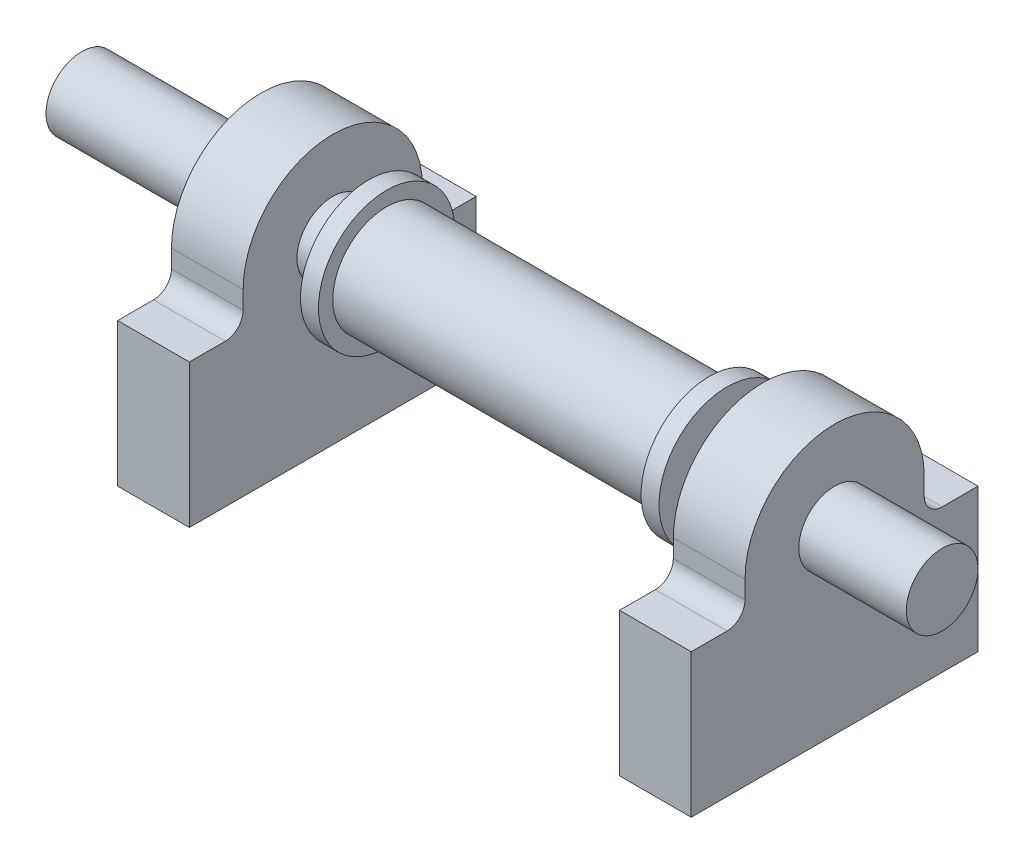
ISO-10303-21;
HEADER;
FILE_DESCRIPTION(('STEP AP214'),'2;1');
FILE_NAME('part.step','',(''),(''),'','','');
FILE_SCHEMA(('AUTOMOTIVE_DESIGN { 1 0 10303 214 1 1 1 1 }'));
ENDSEC;
DATA;
#1=APPLICATION_CONTEXT('core data for automotive mechanical design processes');
#2=APPLICATION_PROTOCOL_DEFINITION('international standard','automotive_design',2000,#1);
#3=PRODUCT_CONTEXT('',#1,'mechanical');
#4=PRODUCT('Part','Part','',(#3));
#5=PRODUCT_RELATED_PRODUCT_CATEGORY('part','',(#4));
#6=PRODUCT_DEFINITION_FORMATION('','',#4);
#7=PRODUCT_DEFINITION_CONTEXT('part definition',#1,'design');
#8=PRODUCT_DEFINITION('design','',#6,#7);
#9=PRODUCT_DEFINITION_SHAPE('','',#8);
#10=(LENGTH_UNIT() NAMED_UNIT(*) SI_UNIT(.MILLI.,.METRE.));
#11=(NAMED_UNIT(*) PLANE_ANGLE_UNIT() SI_UNIT($,.RADIAN.));
#12=(NAMED_UNIT(*) SI_UNIT($,.STERADIAN.) SOLID_ANGLE_UNIT());
#13=UNCERTAINTY_MEASURE_WITH_UNIT(LENGTH_MEASURE(1.E-05),#10,'distance_accuracy_value','');
#14=(GEOMETRIC_REPRESENTATION_CONTEXT(3) GLOBAL_UNCERTAINTY_ASSIGNED_CONTEXT((#13)) GLOBAL_UNIT_ASSIGNED_CONTEXT((#10,
#11,#12)) REPRESENTATION_CONTEXT('',''));
#15=CARTESIAN_POINT('',(0.,0.,0.));
#16=DIRECTION('',(0.,0.,1.));
#17=DIRECTION('',(1.,0.,0.));
#18=AXIS2_PLACEMENT_3D('',#15,#16,#17);
#19=CARTESIAN_POINT('',(-45.,50.,0.));
#20=DIRECTION('',(-1.,0.,0.));
#21=DIRECTION('',(0.,0.,1.));
#22=AXIS2_PLACEMENT_3D('',#19,#20,#21);
#23=CYLINDRICAL_SURFACE('',#22,19.);
#24=CARTESIAN_POINT('',(-45.,50.,0.));
#25=DIRECTION('',(1.,0.,0.));
#26=DIRECTION('',(0.,0.,-1.));
#27=AXIS2_PLACEMENT_3D('',#24,#25,#26);
#28=CIRCLE('',#27,19.);
#29=CARTESIAN_POINT('',(-45.,50.,-19.));
#30=VERTEX_POINT('',#29);
#31=EDGE_CURVE('E344',#30,#30,#28,.T.);
#32=ORIENTED_EDGE('',*,*,#31,.F.);
#33=EDGE_LOOP('',(#32));
#34=FACE_BOUND('',#33,.T.);
#35=CARTESIAN_POINT('',(-50.,50.,0.));
#36=DIRECTION('',(1.,0.,0.));
#37=DIRECTION('',(0.,0.,-1.));
#38=AXIS2_PLACEMENT_3D('',#35,#36,#37);
#39=CIRCLE('',#38,19.);
#40=CARTESIAN_POINT('',(-50.,50.,-19.));
#41=VERTEX_POINT('',#40);
#42=EDGE_CURVE('E348',#41,#41,#39,.T.);
#43=ORIENTED_EDGE('',*,*,#42,.T.);
#44=EDGE_LOOP('',(#43));
#45=FACE_BOUND('',#44,.T.);
#46=ADVANCED_FACE('F35',(#34,#45),#23,.T.);
#47=CARTESIAN_POINT('',(-45.,50.,0.));
#48=DIRECTION('',(1.,0.,0.));
#49=DIRECTION('',(0.,0.,-1.));
#50=AXIS2_PLACEMENT_3D('',#47,#48,#49);
#51=PLANE('',#50);
#52=CARTESIAN_POINT('',(-45.,50.,0.));
#53=DIRECTION('',(1.,0.,0.));
#54=DIRECTION('',(0.,0.,-1.));
#55=AXIS2_PLACEMENT_3D('',#52,#53,#54);
#56=CIRCLE('',#55,15.);
#57=CARTESIAN_POINT('',(-45.,50.,-15.));
#58=VERTEX_POINT('',#57);
#59=EDGE_CURVE('E358',#58,#58,#56,.F.);
#60=ORIENTED_EDGE('',*,*,#59,.T.);
#61=EDGE_LOOP('',(#60));
#62=FACE_BOUND('',#61,.T.);
#63=ORIENTED_EDGE('',*,*,#31,.T.);
#64=EDGE_LOOP('',(#63));
#65=FACE_BOUND('',#64,.T.);
#66=ADVANCED_FACE('F391',(#62,#65),#51,.T.);
#67=CARTESIAN_POINT('',(-50.,50.,0.));
#68=DIRECTION('',(1.,0.,0.));
#69=DIRECTION('',(0.,0.,-1.));
#70=AXIS2_PLACEMENT_3D('',#67,#68,#69);
#71=PLANE('',#70);
#72=ORIENTED_EDGE('',*,*,#42,.F.);
#73=EDGE_LOOP('',(#72));
#74=FACE_BOUND('',#73,.T.);
#75=CARTESIAN_POINT('',(-50.,50.,0.));
#76=DIRECTION('',(1.,0.,0.));
#77=DIRECTION('',(0.,0.,-1.));
#78=AXIS2_PLACEMENT_3D('',#75,#76,#77);
#79=CIRCLE('',#78,10.);
#80=CARTESIAN_POINT('',(-50.,50.,-10.));
#81=VERTEX_POINT('',#80);
#82=EDGE_CURVE('E248',#81,#81,#79,.F.);
#83=ORIENTED_EDGE('',*,*,#82,.F.);
#84=EDGE_LOOP('',(#83));
#85=FACE_BOUND('',#84,.T.);
#86=ADVANCED_FACE('F397',(#74,#85),#71,.F.);
#87=CARTESIAN_POINT('',(-130.,50.,0.));
#88=DIRECTION('',(-1.,0.,0.));
#89=DIRECTION('',(0.,0.,1.));
#90=AXIS2_PLACEMENT_3D('',#87,#88,#89);
#91=PLANE('',#90);
#92=CARTESIAN_POINT('',(-130.,50.,0.));
#93=DIRECTION('',(-1.,0.,0.));
#94=DIRECTION('',(0.,0.,1.));
#95=AXIS2_PLACEMENT_3D('',#92,#93,#94);
#96=CIRCLE('',#95,10.);
#97=CARTESIAN_POINT('',(-130.,50.,10.));
#98=VERTEX_POINT('',#97);
#99=EDGE_CURVE('E264',#98,#98,#96,.T.);
#100=ORIENTED_EDGE('',*,*,#99,.T.);
#101=EDGE_LOOP('',(#100));
#102=FACE_BOUND('',#101,.T.);
#103=ADVANCED_FACE('F443',(#102),#91,.T.);
#104=CARTESIAN_POINT('',(110.,50.,0.));
#105=DIRECTION('',(-1.,0.,0.));
#106=DIRECTION('',(0.,0.,1.));
#107=AXIS2_PLACEMENT_3D('',#104,#105,#106);
#108=CYLINDRICAL_SURFACE('',#107,10.);
#109=ORIENTED_EDGE('',*,*,#99,.F.);
#110=EDGE_LOOP('',(#109));
#111=FACE_BOUND('',#110,.T.);
#112=CARTESIAN_POINT('',(-80.,50.,0.));
#113=DIRECTION('',(-1.,0.,0.));
#114=DIRECTION('',(0.,0.,1.));
#115=AXIS2_PLACEMENT_3D('',#112,#113,#114);
#116=CIRCLE('',#115,10.);
#117=CARTESIAN_POINT('',(-80.,50.,10.));
#118=VERTEX_POINT('',#117);
#119=EDGE_CURVE('E273',#118,#118,#116,.T.);
#120=ORIENTED_EDGE('',*,*,#119,.T.);
#121=EDGE_LOOP('',(#120));
#122=FACE_BOUND('',#121,.T.);
#123=ADVANCED_FACE('F386',(#111,#122),#108,.T.);
#124=CARTESIAN_POINT('',(-80.,40.,-40.));
#125=DIRECTION('',(1.,0.,0.));
#126=DIRECTION('',(0.,0.,-1.));
#127=AXIS2_PLACEMENT_3D('',#124,#125,#126);
#128=PLANE('',#127);
#129=ORIENTED_EDGE('',*,*,#119,.F.);
#130=EDGE_LOOP('',(#129));
#131=FACE_BOUND('',#130,.T.);
#132=DIRECTION('',(0.,0.,1.));
#133=VECTOR('',#132,1.);
#134=CARTESIAN_POINT('',(-80.,0.,-40.));
#135=LINE('',#134,#133);
#136=CARTESIAN_POINT('',(-80.,0.,-40.));
#137=VERTEX_POINT('',#136);
#138=CARTESIAN_POINT('',(-80.,0.,40.));
#139=VERTEX_POINT('',#138);
#140=EDGE_CURVE('E315',#137,#139,#135,.T.);
#141=ORIENTED_EDGE('',*,*,#140,.T.);
#142=DIRECTION('',(0.,-1.,0.));
#143=VECTOR('',#142,1.);
#144=CARTESIAN_POINT('',(-80.,40.,40.));
#145=LINE('',#144,#143);
#146=CARTESIAN_POINT('',(-80.,40.,40.));
#147=VERTEX_POINT('',#146);
#148=EDGE_CURVE('E321',#147,#139,#145,.T.);
#149=ORIENTED_EDGE('',*,*,#148,.F.);
#150=DIRECTION('',(0.,0.,1.));
#151=VECTOR('',#150,1.);
#152=CARTESIAN_POINT('',(-80.,40.,-40.));
#153=LINE('',#152,#151);
#154=CARTESIAN_POINT('',(-80.,40.,30.));
#155=VERTEX_POINT('',#154);
#156=EDGE_CURVE('E304',#155,#147,#153,.T.);
#157=ORIENTED_EDGE('',*,*,#156,.F.);
#158=CARTESIAN_POINT('',(-80.,45.,30.));
#159=DIRECTION('',(1.,0.,0.));
#160=DIRECTION('',(0.,0.,-1.));
#161=AXIS2_PLACEMENT_3D('',#158,#159,#160);
#162=CIRCLE('',#161,5.);
#163=CARTESIAN_POINT('',(-80.,45.,25.));
#164=VERTEX_POINT('',#163);
#165=EDGE_CURVE('E44',#155,#164,#162,.T.);
#166=ORIENTED_EDGE('',*,*,#165,.T.);
#167=DIRECTION('',(0.,1.,0.));
#168=VECTOR('',#167,1.);
#169=CARTESIAN_POINT('',(-80.,40.,25.));
#170=LINE('',#169,#168);
#171=CARTESIAN_POINT('',(-80.,50.,25.));
#172=VERTEX_POINT('',#171);
#173=EDGE_CURVE('E281',#164,#172,#170,.T.);
#174=ORIENTED_EDGE('',*,*,#173,.T.);
#175=CARTESIAN_POINT('',(-80.,50.,0.));
#176=DIRECTION('',(-1.,0.,0.));
#177=DIRECTION('',(0.,0.,1.));
#178=AXIS2_PLACEMENT_3D('',#175,#176,#177);
#179=CIRCLE('',#178,25.);
#180=CARTESIAN_POINT('',(-80.,50.,-25.));
#181=VERTEX_POINT('',#180);
#182=EDGE_CURVE('E276',#172,#181,#179,.T.);
#183=ORIENTED_EDGE('',*,*,#182,.T.);
#184=DIRECTION('',(0.,-1.,0.));
#185=VECTOR('',#184,1.);
#186=CARTESIAN_POINT('',(-80.,50.,-25.));
#187=LINE('',#186,#185);
#188=CARTESIAN_POINT('',(-80.,45.,-25.));
#189=VERTEX_POINT('',#188);
#190=EDGE_CURVE('E289',#181,#189,#187,.T.);
#191=ORIENTED_EDGE('',*,*,#190,.T.);
#192=CARTESIAN_POINT('',(-80.,45.,-30.));
#193=DIRECTION('',(1.,0.,0.));
#194=DIRECTION('',(0.,0.,-1.));
#195=AXIS2_PLACEMENT_3D('',#192,#193,#194);
#196=CIRCLE('',#195,5.);
#197=CARTESIAN_POINT('',(-80.,40.,-30.));
#198=VERTEX_POINT('',#197);
#199=EDGE_CURVE('E339',#189,#198,#196,.T.);
#200=ORIENTED_EDGE('',*,*,#199,.T.);
#201=CARTESIAN_POINT('',(-80.,40.,-40.));
#202=VERTEX_POINT('',#201);
#203=EDGE_CURVE('E305',#202,#198,#153,.T.);
#204=ORIENTED_EDGE('',*,*,#203,.F.);
#205=DIRECTION('',(0.,-1.,0.));
#206=VECTOR('',#205,1.);
#207=CARTESIAN_POINT('',(-80.,40.,-40.));
#208=LINE('',#207,#206);
#209=EDGE_CURVE('E324',#202,#137,#208,.T.);
#210=ORIENTED_EDGE('',*,*,#209,.T.);
#211=EDGE_LOOP('',(#141,#149,#157,#166,#174,#183,#191,#200,#204,#210));
#212=FACE_BOUND('',#211,.T.);
#213=ADVANCED_FACE('F474',(#131,#212),#128,.F.);
#214=CARTESIAN_POINT('',(-80.,40.,40.));
#215=DIRECTION('',(0.,0.,-1.));
#216=DIRECTION('',(-1.,0.,0.));
#217=AXIS2_PLACEMENT_3D('',#214,#215,#216);
#218=PLANE('',#217);
#219=DIRECTION('',(1.,0.,0.));
#220=VECTOR('',#219,1.);
#221=CARTESIAN_POINT('',(-80.,0.,40.));
#222=LINE('',#221,#220);
#223=CARTESIAN_POINT('',(-60.,0.,40.));
#224=VERTEX_POINT('',#223);
#225=EDGE_CURVE('E317',#139,#224,#222,.T.);
#226=ORIENTED_EDGE('',*,*,#225,.T.);
#227=DIRECTION('',(0.,-1.,0.));
#228=VECTOR('',#227,1.);
#229=CARTESIAN_POINT('',(-60.,40.,40.));
#230=LINE('',#229,#228);
#231=CARTESIAN_POINT('',(-60.,40.,40.));
#232=VERTEX_POINT('',#231);
#233=EDGE_CURVE('E310',#232,#224,#230,.T.);
#234=ORIENTED_EDGE('',*,*,#233,.F.);
#235=DIRECTION('',(1.,0.,0.));
#236=VECTOR('',#235,1.);
#237=CARTESIAN_POINT('',(-80.,40.,40.));
#238=LINE('',#237,#236);
#239=EDGE_CURVE('E308',#147,#232,#238,.T.);
#240=ORIENTED_EDGE('',*,*,#239,.F.);
#241=ORIENTED_EDGE('',*,*,#148,.T.);
#242=EDGE_LOOP('',(#226,#234,#240,#241));
#243=FACE_BOUND('',#242,.T.);
#244=ADVANCED_FACE('F471',(#243),#218,.F.);
#245=CARTESIAN_POINT('',(0.,40.,0.));
#246=DIRECTION('',(0.,1.,0.));
#247=DIRECTION('',(0.,0.,1.));
#248=AXIS2_PLACEMENT_3D('',#245,#246,#247);
#249=PLANE('',#248);
#250=DIRECTION('',(0.,0.,-1.));
#251=VECTOR('',#250,1.);
#252=CARTESIAN_POINT('',(-60.,40.,-40.));
#253=LINE('',#252,#251);
#254=CARTESIAN_POINT('',(-60.,40.,30.));
#255=VERTEX_POINT('',#254);
#256=EDGE_CURVE('E298',#232,#255,#253,.T.);
#257=ORIENTED_EDGE('',*,*,#256,.T.);
#258=DIRECTION('',(-1.,0.,0.));
#259=VECTOR('',#258,1.);
#260=CARTESIAN_POINT('',(-80.,40.,30.));
#261=LINE('',#260,#259);
#262=EDGE_CURVE('E335',#255,#155,#261,.T.);
#263=ORIENTED_EDGE('',*,*,#262,.T.);
#264=ORIENTED_EDGE('',*,*,#156,.T.);
#265=ORIENTED_EDGE('',*,*,#239,.T.);
#266=EDGE_LOOP('',(#257,#263,#264,#265));
#267=FACE_BOUND('',#266,.T.);
#268=ADVANCED_FACE('F466',(#267),#249,.T.);
#269=CARTESIAN_POINT('',(0.,45.,30.));
#270=DIRECTION('',(1.,0.,0.));
#271=DIRECTION('',(0.,0.,-1.));
#272=AXIS2_PLACEMENT_3D('',#269,#270,#271);
#273=CYLINDRICAL_SURFACE('',#272,5.);
#274=CARTESIAN_POINT('',(-60.,45.,30.));
#275=DIRECTION('',(-1.,0.,0.));
#276=DIRECTION('',(0.,0.,1.));
#277=AXIS2_PLACEMENT_3D('',#274,#275,#276);
#278=CIRCLE('',#277,5.);
#279=CARTESIAN_POINT('',(-60.,45.,25.));
#280=VERTEX_POINT('',#279);
#281=EDGE_CURVE('E11',#280,#255,#278,.T.);
#282=ORIENTED_EDGE('',*,*,#281,.F.);
#283=DIRECTION('',(-1.,0.,0.));
#284=VECTOR('',#283,1.);
#285=CARTESIAN_POINT('',(-60.,45.,25.));
#286=LINE('',#285,#284);
#287=EDGE_CURVE('E52',#164,#280,#286,.F.);
#288=ORIENTED_EDGE('',*,*,#287,.F.);
#289=ORIENTED_EDGE('',*,*,#165,.F.);
#290=ORIENTED_EDGE('',*,*,#262,.F.);
#291=EDGE_LOOP('',(#282,#288,#289,#290));
#292=FACE_BOUND('',#291,.T.);
#293=ADVANCED_FACE('F37',(#292),#273,.F.);
#294=CARTESIAN_POINT('',(-60.,40.,25.));
#295=DIRECTION('',(0.,0.,1.));
#296=DIRECTION('',(1.,0.,0.));
#297=AXIS2_PLACEMENT_3D('',#294,#295,#296);
#298=PLANE('',#297);
#299=ORIENTED_EDGE('',*,*,#173,.F.);
#300=ORIENTED_EDGE('',*,*,#287,.T.);
#301=DIRECTION('',(0.,1.,0.));
#302=VECTOR('',#301,1.);
#303=CARTESIAN_POINT('',(-60.,40.,25.));
#304=LINE('',#303,#302);
#305=CARTESIAN_POINT('',(-60.,50.,25.));
#306=VERTEX_POINT('',#305);
#307=EDGE_CURVE('E284',#280,#306,#304,.T.);
#308=ORIENTED_EDGE('',*,*,#307,.T.);
#309=DIRECTION('',(-1.,0.,0.));
#310=VECTOR('',#309,1.);
#311=CARTESIAN_POINT('',(-60.,50.,25.));
#312=LINE('',#311,#310);
#313=EDGE_CURVE('E293',#306,#172,#312,.T.);
#314=ORIENTED_EDGE('',*,*,#313,.T.);
#315=EDGE_LOOP('',(#299,#300,#308,#314));
#316=FACE_BOUND('',#315,.T.);
#317=ADVANCED_FACE('F449',(#316),#298,.T.);
#318=CARTESIAN_POINT('',(-60.,50.,0.));
#319=DIRECTION('',(-1.,0.,0.));
#320=DIRECTION('',(0.,0.,1.));
#321=AXIS2_PLACEMENT_3D('',#318,#319,#320);
#322=CYLINDRICAL_SURFACE('',#321,25.);
#323=ORIENTED_EDGE('',*,*,#182,.F.);
#324=ORIENTED_EDGE('',*,*,#313,.F.);
#325=CARTESIAN_POINT('',(-60.,50.,0.));
#326=DIRECTION('',(-1.,0.,0.));
#327=DIRECTION('',(0.,0.,1.));
#328=AXIS2_PLACEMENT_3D('',#325,#326,#327);
#329=CIRCLE('',#328,25.);
#330=CARTESIAN_POINT('',(-60.,50.,-25.));
#331=VERTEX_POINT('',#330);
#332=EDGE_CURVE('E277',#306,#331,#329,.T.);
#333=ORIENTED_EDGE('',*,*,#332,.T.);
#334=DIRECTION('',(-1.,0.,0.));
#335=VECTOR('',#334,1.);
#336=CARTESIAN_POINT('',(-60.,50.,-25.));
#337=LINE('',#336,#335);
#338=EDGE_CURVE('E286',#331,#181,#337,.T.);
#339=ORIENTED_EDGE('',*,*,#338,.T.);
#340=EDGE_LOOP('',(#323,#324,#333,#339));
#341=FACE_BOUND('',#340,.T.);
#342=ADVANCED_FACE('F452',(#341),#322,.T.);
#343=CARTESIAN_POINT('',(-60.,50.,-25.));
#344=DIRECTION('',(0.,0.,-1.));
#345=DIRECTION('',(-1.,0.,0.));
#346=AXIS2_PLACEMENT_3D('',#343,#344,#345);
#347=PLANE('',#346);
#348=DIRECTION('',(0.,-1.,0.));
#349=VECTOR('',#348,1.);
#350=CARTESIAN_POINT('',(-60.,50.,-25.));
#351=LINE('',#350,#349);
#352=CARTESIAN_POINT('',(-60.,45.,-25.));
#353=VERTEX_POINT('',#352);
#354=EDGE_CURVE('E280',#331,#353,#351,.T.);
#355=ORIENTED_EDGE('',*,*,#354,.T.);
#356=DIRECTION('',(-1.,0.,0.));
#357=VECTOR('',#356,1.);
#358=CARTESIAN_POINT('',(-80.,45.,-25.));
#359=LINE('',#358,#357);
#360=EDGE_CURVE('E330',#353,#189,#359,.T.);
#361=ORIENTED_EDGE('',*,*,#360,.T.);
#362=ORIENTED_EDGE('',*,*,#190,.F.);
#363=ORIENTED_EDGE('',*,*,#338,.F.);
#364=EDGE_LOOP('',(#355,#361,#362,#363));
#365=FACE_BOUND('',#364,.T.);
#366=ADVANCED_FACE('F453',(#365),#347,.T.);
#367=CARTESIAN_POINT('',(-60.,45.,-30.));
#368=DIRECTION('',(1.,0.,0.));
#369=DIRECTION('',(0.,0.,-1.));
#370=AXIS2_PLACEMENT_3D('',#367,#368,#369);
#371=CYLINDRICAL_SURFACE('',#370,5.);
#372=CARTESIAN_POINT('',(-60.,45.,-30.));
#373=DIRECTION('',(-1.,0.,0.));
#374=DIRECTION('',(0.,0.,1.));
#375=AXIS2_PLACEMENT_3D('',#372,#373,#374);
#376=CIRCLE('',#375,5.);
#377=CARTESIAN_POINT('',(-60.,40.,-30.));
#378=VERTEX_POINT('',#377);
#379=EDGE_CURVE('E341',#378,#353,#376,.T.);
#380=ORIENTED_EDGE('',*,*,#379,.F.);
#381=DIRECTION('',(-1.,0.,0.));
#382=VECTOR('',#381,1.);
#383=CARTESIAN_POINT('',(-60.,40.,-30.));
#384=LINE('',#383,#382);
#385=EDGE_CURVE('E333',#198,#378,#384,.F.);
#386=ORIENTED_EDGE('',*,*,#385,.F.);
#387=ORIENTED_EDGE('',*,*,#199,.F.);
#388=ORIENTED_EDGE('',*,*,#360,.F.);
#389=EDGE_LOOP('',(#380,#386,#387,#388));
#390=FACE_BOUND('',#389,.T.);
#391=ADVANCED_FACE('F456',(#390),#371,.F.);
#392=ORIENTED_EDGE('',*,*,#203,.T.);
#393=ORIENTED_EDGE('',*,*,#385,.T.);
#394=CARTESIAN_POINT('',(-60.,40.,-40.));
#395=VERTEX_POINT('',#394);
#396=EDGE_CURVE('E302',#378,#395,#253,.T.);
#397=ORIENTED_EDGE('',*,*,#396,.T.);
#398=DIRECTION('',(-1.,0.,0.));
#399=VECTOR('',#398,1.);
#400=CARTESIAN_POINT('',(-80.,40.,-40.));
#401=LINE('',#400,#399);
#402=EDGE_CURVE('E301',#395,#202,#401,.T.);
#403=ORIENTED_EDGE('',*,*,#402,.T.);
#404=EDGE_LOOP('',(#392,#393,#397,#403));
#405=FACE_BOUND('',#404,.T.);
#406=ADVANCED_FACE('F461',(#405),#249,.T.);
#407=CARTESIAN_POINT('',(-80.,40.,-40.));
#408=DIRECTION('',(0.,0.,1.));
#409=DIRECTION('',(1.,0.,0.));
#410=AXIS2_PLACEMENT_3D('',#407,#408,#409);
#411=PLANE('',#410);
#412=DIRECTION('',(-1.,0.,0.));
#413=VECTOR('',#412,1.);
#414=CARTESIAN_POINT('',(-80.,0.,-40.));
#415=LINE('',#414,#413);
#416=CARTESIAN_POINT('',(-60.,0.,-40.));
#417=VERTEX_POINT('',#416);
#418=EDGE_CURVE('E313',#417,#137,#415,.T.);
#419=ORIENTED_EDGE('',*,*,#418,.T.);
#420=ORIENTED_EDGE('',*,*,#209,.F.);
#421=ORIENTED_EDGE('',*,*,#402,.F.);
#422=DIRECTION('',(0.,-1.,0.));
#423=VECTOR('',#422,1.);
#424=CARTESIAN_POINT('',(-60.,40.,-40.));
#425=LINE('',#424,#423);
#426=EDGE_CURVE('E327',#395,#417,#425,.T.);
#427=ORIENTED_EDGE('',*,*,#426,.T.);
#428=EDGE_LOOP('',(#419,#420,#421,#427));
#429=FACE_BOUND('',#428,.T.);
#430=ADVANCED_FACE('F464',(#429),#411,.F.);
#431=CARTESIAN_POINT('',(0.,0.,0.));
#432=DIRECTION('',(0.,1.,0.));
#433=DIRECTION('',(0.,0.,1.));
#434=AXIS2_PLACEMENT_3D('',#431,#432,#433);
#435=PLANE('',#434);
#436=DIRECTION('',(0.,0.,-1.));
#437=VECTOR('',#436,1.);
#438=CARTESIAN_POINT('',(-60.,0.,-40.));
#439=LINE('',#438,#437);
#440=EDGE_CURVE('E296',#224,#417,#439,.T.);
#441=ORIENTED_EDGE('',*,*,#440,.F.);
#442=ORIENTED_EDGE('',*,*,#225,.F.);
#443=ORIENTED_EDGE('',*,*,#140,.F.);
#444=ORIENTED_EDGE('',*,*,#418,.F.);
#445=EDGE_LOOP('',(#441,#442,#443,#444));
#446=FACE_BOUND('',#445,.T.);
#447=ADVANCED_FACE('F467',(#446),#435,.F.);
#448=CARTESIAN_POINT('',(-60.,40.,-40.));
#449=DIRECTION('',(-1.,0.,0.));
#450=DIRECTION('',(0.,0.,1.));
#451=AXIS2_PLACEMENT_3D('',#448,#449,#450);
#452=PLANE('',#451);
#453=CARTESIAN_POINT('',(-60.,50.,0.));
#454=DIRECTION('',(-1.,0.,0.));
#455=DIRECTION('',(0.,0.,1.));
#456=AXIS2_PLACEMENT_3D('',#453,#454,#455);
#457=CIRCLE('',#456,10.);
#458=CARTESIAN_POINT('',(-60.,50.,10.));
#459=VERTEX_POINT('',#458);
#460=EDGE_CURVE('E270',#459,#459,#457,.T.);
#461=ORIENTED_EDGE('',*,*,#460,.T.);
#462=EDGE_LOOP('',(#461));
#463=FACE_BOUND('',#462,.T.);
#464=ORIENTED_EDGE('',*,*,#440,.T.);
#465=ORIENTED_EDGE('',*,*,#426,.F.);
#466=ORIENTED_EDGE('',*,*,#396,.F.);
#467=ORIENTED_EDGE('',*,*,#379,.T.);
#468=ORIENTED_EDGE('',*,*,#354,.F.);
#469=ORIENTED_EDGE('',*,*,#332,.F.);
#470=ORIENTED_EDGE('',*,*,#307,.F.);
#471=ORIENTED_EDGE('',*,*,#281,.T.);
#472=ORIENTED_EDGE('',*,*,#256,.F.);
#473=ORIENTED_EDGE('',*,*,#233,.T.);
#474=EDGE_LOOP('',(#464,#465,#466,#467,#468,#469,#470,#471,#472,#473));
#475=FACE_BOUND('',#474,.T.);
#476=ADVANCED_FACE('F383',(#463,#475),#452,.F.);
#477=ORIENTED_EDGE('',*,*,#460,.F.);
#478=EDGE_LOOP('',(#477));
#479=FACE_BOUND('',#478,.T.);
#480=ORIENTED_EDGE('',*,*,#82,.T.);
#481=EDGE_LOOP('',(#480));
#482=FACE_BOUND('',#481,.T.);
#483=ADVANCED_FACE('F373',(#479,#482),#108,.T.);
#484=CARTESIAN_POINT('',(50.,50.,0.));
#485=DIRECTION('',(-1.,0.,0.));
#486=DIRECTION('',(0.,0.,1.));
#487=AXIS2_PLACEMENT_3D('',#484,#485,#486);
#488=CYLINDRICAL_SURFACE('',#487,15.);
#489=ORIENTED_EDGE('',*,*,#59,.F.);
#490=EDGE_LOOP('',(#489));
#491=FACE_BOUND('',#490,.T.);
#492=CARTESIAN_POINT('',(45.,50.,0.));
#493=DIRECTION('',(-1.,0.,0.));
#494=DIRECTION('',(0.,0.,1.));
#495=AXIS2_PLACEMENT_3D('',#492,#493,#494);
#496=CIRCLE('',#495,15.);
#497=CARTESIAN_POINT('',(45.,50.,15.));
#498=VERTEX_POINT('',#497);
#499=EDGE_CURVE('E363',#498,#498,#496,.F.);
#500=ORIENTED_EDGE('',*,*,#499,.F.);
#501=EDGE_LOOP('',(#500));
#502=FACE_BOUND('',#501,.T.);
#503=ADVANCED_FACE('F370',(#491,#502),#488,.T.);
#504=CARTESIAN_POINT('',(110.,50.,0.));
#505=DIRECTION('',(-1.,0.,0.));
#506=DIRECTION('',(0.,0.,1.));
#507=AXIS2_PLACEMENT_3D('',#504,#505,#506);
#508=PLANE('',#507);
#509=CARTESIAN_POINT('',(110.,50.,0.));
#510=DIRECTION('',(-1.,0.,0.));
#511=DIRECTION('',(0.,0.,1.));
#512=AXIS2_PLACEMENT_3D('',#509,#510,#511);
#513=CIRCLE('',#512,10.);
#514=CARTESIAN_POINT('',(110.,50.,9.99999999999995));
#515=VERTEX_POINT('',#514);
#516=EDGE_CURVE('E267',#515,#515,#513,.T.);
#517=ORIENTED_EDGE('',*,*,#516,.F.);
#518=EDGE_LOOP('',(#517));
#519=FACE_BOUND('',#518,.T.);
#520=ADVANCED_FACE('F372',(#519),#508,.F.);
#521=ORIENTED_EDGE('',*,*,#516,.T.);
#522=EDGE_LOOP('',(#521));
#523=FACE_BOUND('',#522,.T.);
#524=CARTESIAN_POINT('',(80.,50.,0.));
#525=DIRECTION('',(-1.,0.,0.));
#526=DIRECTION('',(0.,0.,1.));
#527=AXIS2_PLACEMENT_3D('',#524,#525,#526);
#528=CIRCLE('',#527,10.);
#529=CARTESIAN_POINT('',(80.,50.,9.99999999999996));
#530=VERTEX_POINT('',#529);
#531=EDGE_CURVE('E203',#530,#530,#528,.T.);
#532=ORIENTED_EDGE('',*,*,#531,.F.);
#533=EDGE_LOOP('',(#532));
#534=FACE_BOUND('',#533,.T.);
#535=ADVANCED_FACE('F380',(#523,#534),#108,.T.);
#536=CARTESIAN_POINT('',(80.,40.,-40.));
#537=DIRECTION('',(-1.,0.,0.));
#538=DIRECTION('',(0.,0.,1.));
#539=AXIS2_PLACEMENT_3D('',#536,#537,#538);
#540=PLANE('',#539);
#541=ORIENTED_EDGE('',*,*,#531,.T.);
#542=EDGE_LOOP('',(#541));
#543=FACE_BOUND('',#542,.T.);
#544=DIRECTION('',(0.,0.,-1.));
#545=VECTOR('',#544,1.);
#546=CARTESIAN_POINT('',(80.,0.,-40.));
#547=LINE('',#546,#545);
#548=CARTESIAN_POINT('',(80.,0.,40.));
#549=VERTEX_POINT('',#548);
#550=CARTESIAN_POINT('',(80.,0.,-40.));
#551=VERTEX_POINT('',#550);
#552=EDGE_CURVE('E210',#549,#551,#547,.T.);
#553=ORIENTED_EDGE('',*,*,#552,.T.);
#554=DIRECTION('',(0.,-1.,0.));
#555=VECTOR('',#554,1.);
#556=CARTESIAN_POINT('',(80.,40.,-40.));
#557=LINE('',#556,#555);
#558=CARTESIAN_POINT('',(80.,40.,-40.));
#559=VERTEX_POINT('',#558);
#560=EDGE_CURVE('E241',#559,#551,#557,.T.);
#561=ORIENTED_EDGE('',*,*,#560,.F.);
#562=DIRECTION('',(0.,0.,-1.));
#563=VECTOR('',#562,1.);
#564=CARTESIAN_POINT('',(80.,40.,-40.));
#565=LINE('',#564,#563);
#566=CARTESIAN_POINT('',(80.,40.,-30.));
#567=VERTEX_POINT('',#566);
#568=EDGE_CURVE('E216',#567,#559,#565,.T.);
#569=ORIENTED_EDGE('',*,*,#568,.F.);
#570=CARTESIAN_POINT('',(80.,45.,-30.));
#571=DIRECTION('',(-1.,0.,0.));
#572=DIRECTION('',(0.,0.,1.));
#573=AXIS2_PLACEMENT_3D('',#570,#571,#572);
#574=CIRCLE('',#573,5.);
#575=CARTESIAN_POINT('',(80.,45.,-25.));
#576=VERTEX_POINT('',#575);
#577=EDGE_CURVE('E257',#567,#576,#574,.T.);
#578=ORIENTED_EDGE('',*,*,#577,.T.);
#579=DIRECTION('',(0.,1.,0.));
#580=VECTOR('',#579,1.);
#581=CARTESIAN_POINT('',(80.,40.,-25.));
#582=LINE('',#581,#580);
#583=CARTESIAN_POINT('',(80.,50.,-25.));
#584=VERTEX_POINT('',#583);
#585=EDGE_CURVE('E199',#576,#584,#582,.T.);
#586=ORIENTED_EDGE('',*,*,#585,.T.);
#587=CARTESIAN_POINT('',(80.,50.,0.));
#588=DIRECTION('',(1.,0.,0.));
#589=DIRECTION('',(0.,0.,-1.));
#590=AXIS2_PLACEMENT_3D('',#587,#588,#589);
#591=CIRCLE('',#590,25.);
#592=CARTESIAN_POINT('',(80.,50.,25.0000000000001));
#593=VERTEX_POINT('',#592);
#594=EDGE_CURVE('E207',#584,#593,#591,.T.);
#595=ORIENTED_EDGE('',*,*,#594,.T.);
#596=DIRECTION('',(0.,-1.,0.));
#597=VECTOR('',#596,1.);
#598=CARTESIAN_POINT('',(80.,50.,25.0000000000001));
#599=LINE('',#598,#597);
#600=CARTESIAN_POINT('',(80.,45.,25.0000000000001));
#601=VERTEX_POINT('',#600);
#602=EDGE_CURVE('E179',#593,#601,#599,.T.);
#603=ORIENTED_EDGE('',*,*,#602,.T.);
#604=CARTESIAN_POINT('',(80.,45.,30.0000000000001));
#605=DIRECTION('',(-1.,0.,0.));
#606=DIRECTION('',(0.,0.,1.));
#607=AXIS2_PLACEMENT_3D('',#604,#605,#606);
#608=CIRCLE('',#607,5.);
#609=CARTESIAN_POINT('',(80.,40.,30.0000000000001));
#610=VERTEX_POINT('',#609);
#611=EDGE_CURVE('E261',#601,#610,#608,.T.);
#612=ORIENTED_EDGE('',*,*,#611,.T.);
#613=CARTESIAN_POINT('',(80.,40.,40.));
#614=VERTEX_POINT('',#613);
#615=EDGE_CURVE('E212',#614,#610,#565,.T.);
#616=ORIENTED_EDGE('',*,*,#615,.F.);
#617=DIRECTION('',(0.,-1.,0.));
#618=VECTOR('',#617,1.);
#619=CARTESIAN_POINT('',(80.,40.,40.));
#620=LINE('',#619,#618);
#621=EDGE_CURVE('E224',#614,#549,#620,.T.);
#622=ORIENTED_EDGE('',*,*,#621,.T.);
#623=EDGE_LOOP('',(#553,#561,#569,#578,#586,#595,#603,#612,#616,#622));
#624=FACE_BOUND('',#623,.T.);
#625=ADVANCED_FACE('F432',(#543,#624),#540,.F.);
#626=CARTESIAN_POINT('',(80.,40.,-40.));
#627=DIRECTION('',(0.,0.,1.));
#628=DIRECTION('',(1.,0.,0.));
#629=AXIS2_PLACEMENT_3D('',#626,#627,#628);
#630=PLANE('',#629);
#631=DIRECTION('',(-1.,0.,0.));
#632=VECTOR('',#631,1.);
#633=CARTESIAN_POINT('',(80.,0.,-40.));
#634=LINE('',#633,#632);
#635=CARTESIAN_POINT('',(60.,0.,-40.));
#636=VERTEX_POINT('',#635);
#637=EDGE_CURVE('E227',#551,#636,#634,.T.);
#638=ORIENTED_EDGE('',*,*,#637,.T.);
#639=DIRECTION('',(0.,-1.,0.));
#640=VECTOR('',#639,1.);
#641=CARTESIAN_POINT('',(60.,40.,-40.));
#642=LINE('',#641,#640);
#643=CARTESIAN_POINT('',(60.,40.,-40.));
#644=VERTEX_POINT('',#643);
#645=EDGE_CURVE('E238',#644,#636,#642,.T.);
#646=ORIENTED_EDGE('',*,*,#645,.F.);
#647=DIRECTION('',(-1.,0.,0.));
#648=VECTOR('',#647,1.);
#649=CARTESIAN_POINT('',(80.,40.,-40.));
#650=LINE('',#649,#648);
#651=EDGE_CURVE('E215',#559,#644,#650,.T.);
#652=ORIENTED_EDGE('',*,*,#651,.F.);
#653=ORIENTED_EDGE('',*,*,#560,.T.);
#654=EDGE_LOOP('',(#638,#646,#652,#653));
#655=FACE_BOUND('',#654,.T.);
#656=ADVANCED_FACE('F416',(#655),#630,.F.);
#657=CARTESIAN_POINT('',(0.,40.,0.));
#658=DIRECTION('',(0.,-1.,0.));
#659=DIRECTION('',(0.,0.,-1.));
#660=AXIS2_PLACEMENT_3D('',#657,#658,#659);
#661=PLANE('',#660);
#662=DIRECTION('',(0.,0.,1.));
#663=VECTOR('',#662,1.);
#664=CARTESIAN_POINT('',(60.,40.,-40.));
#665=LINE('',#664,#663);
#666=CARTESIAN_POINT('',(60.,40.,-30.));
#667=VERTEX_POINT('',#666);
#668=EDGE_CURVE('E219',#644,#667,#665,.T.);
#669=ORIENTED_EDGE('',*,*,#668,.T.);
#670=DIRECTION('',(1.,0.,0.));
#671=VECTOR('',#670,1.);
#672=CARTESIAN_POINT('',(0.,40.,-30.));
#673=LINE('',#672,#671);
#674=EDGE_CURVE('E244',#667,#567,#673,.T.);
#675=ORIENTED_EDGE('',*,*,#674,.T.);
#676=ORIENTED_EDGE('',*,*,#568,.T.);
#677=ORIENTED_EDGE('',*,*,#651,.T.);
#678=EDGE_LOOP('',(#669,#675,#676,#677));
#679=FACE_BOUND('',#678,.T.);
#680=ADVANCED_FACE('F413',(#679),#661,.F.);
#681=CARTESIAN_POINT('',(0.,45.,-30.));
#682=DIRECTION('',(1.,0.,0.));
#683=DIRECTION('',(0.,0.,-1.));
#684=AXIS2_PLACEMENT_3D('',#681,#682,#683);
#685=CYLINDRICAL_SURFACE('',#684,5.);
#686=CARTESIAN_POINT('',(60.,45.,-30.));
#687=DIRECTION('',(1.,0.,0.));
#688=DIRECTION('',(0.,0.,-1.));
#689=AXIS2_PLACEMENT_3D('',#686,#687,#688);
#690=CIRCLE('',#689,5.);
#691=CARTESIAN_POINT('',(60.,45.,-25.));
#692=VERTEX_POINT('',#691);
#693=EDGE_CURVE('E259',#692,#667,#690,.T.);
#694=ORIENTED_EDGE('',*,*,#693,.F.);
#695=DIRECTION('',(1.,0.,0.));
#696=VECTOR('',#695,1.);
#697=CARTESIAN_POINT('',(60.,45.,-25.));
#698=LINE('',#697,#696);
#699=EDGE_CURVE('E251',#576,#692,#698,.F.);
#700=ORIENTED_EDGE('',*,*,#699,.F.);
#701=ORIENTED_EDGE('',*,*,#577,.F.);
#702=ORIENTED_EDGE('',*,*,#674,.F.);
#703=EDGE_LOOP('',(#694,#700,#701,#702));
#704=FACE_BOUND('',#703,.T.);
#705=ADVANCED_FACE('F406',(#704),#685,.F.);
#706=CARTESIAN_POINT('',(60.,40.,-25.));
#707=DIRECTION('',(0.,0.,-1.));
#708=DIRECTION('',(-1.,0.,0.));
#709=AXIS2_PLACEMENT_3D('',#706,#707,#708);
#710=PLANE('',#709);
#711=ORIENTED_EDGE('',*,*,#585,.F.);
#712=ORIENTED_EDGE('',*,*,#699,.T.);
#713=DIRECTION('',(0.,1.,0.));
#714=VECTOR('',#713,1.);
#715=CARTESIAN_POINT('',(60.,40.,-25.));
#716=LINE('',#715,#714);
#717=CARTESIAN_POINT('',(60.,50.,-25.));
#718=VERTEX_POINT('',#717);
#719=EDGE_CURVE('E185',#692,#718,#716,.T.);
#720=ORIENTED_EDGE('',*,*,#719,.T.);
#721=DIRECTION('',(1.,0.,0.));
#722=VECTOR('',#721,1.);
#723=CARTESIAN_POINT('',(60.,50.,-25.));
#724=LINE('',#723,#722);
#725=EDGE_CURVE('E184',#718,#584,#724,.T.);
#726=ORIENTED_EDGE('',*,*,#725,.T.);
#727=EDGE_LOOP('',(#711,#712,#720,#726));
#728=FACE_BOUND('',#727,.T.);
#729=ADVANCED_FACE('F403',(#728),#710,.T.);
#730=CARTESIAN_POINT('',(60.,50.,0.));
#731=DIRECTION('',(1.,0.,0.));
#732=DIRECTION('',(0.,0.,-1.));
#733=AXIS2_PLACEMENT_3D('',#730,#731,#732);
#734=CYLINDRICAL_SURFACE('',#733,25.);
#735=ORIENTED_EDGE('',*,*,#594,.F.);
#736=ORIENTED_EDGE('',*,*,#725,.F.);
#737=CARTESIAN_POINT('',(60.,50.,0.));
#738=DIRECTION('',(1.,0.,0.));
#739=DIRECTION('',(0.,0.,-1.));
#740=AXIS2_PLACEMENT_3D('',#737,#738,#739);
#741=CIRCLE('',#740,25.);
#742=CARTESIAN_POINT('',(60.,50.,25.));
#743=VERTEX_POINT('',#742);
#744=EDGE_CURVE('E191',#718,#743,#741,.T.);
#745=ORIENTED_EDGE('',*,*,#744,.T.);
#746=DIRECTION('',(1.,0.,0.));
#747=VECTOR('',#746,1.);
#748=CARTESIAN_POINT('',(60.,50.,25.));
#749=LINE('',#748,#747);
#750=EDGE_CURVE('E172',#743,#593,#749,.T.);
#751=ORIENTED_EDGE('',*,*,#750,.T.);
#752=EDGE_LOOP('',(#735,#736,#745,#751));
#753=FACE_BOUND('',#752,.T.);
#754=ADVANCED_FACE('F197',(#753),#734,.T.);
#755=CARTESIAN_POINT('',(60.,50.,25.));
#756=DIRECTION('',(0.,0.,1.));
#757=DIRECTION('',(1.,0.,0.));
#758=AXIS2_PLACEMENT_3D('',#755,#756,#757);
#759=PLANE('',#758);
#760=DIRECTION('',(0.,-1.,0.));
#761=VECTOR('',#760,1.);
#762=CARTESIAN_POINT('',(60.,50.,25.));
#763=LINE('',#762,#761);
#764=CARTESIAN_POINT('',(60.,45.,25.));
#765=VERTEX_POINT('',#764);
#766=EDGE_CURVE('E176',#743,#765,#763,.T.);
#767=ORIENTED_EDGE('',*,*,#766,.T.);
#768=DIRECTION('',(1.,0.,0.));
#769=VECTOR('',#768,1.);
#770=CARTESIAN_POINT('',(60.,45.,25.));
#771=LINE('',#770,#769);
#772=EDGE_CURVE('E253',#765,#601,#771,.T.);
#773=ORIENTED_EDGE('',*,*,#772,.T.);
#774=ORIENTED_EDGE('',*,*,#602,.F.);
#775=ORIENTED_EDGE('',*,*,#750,.F.);
#776=EDGE_LOOP('',(#767,#773,#774,#775));
#777=FACE_BOUND('',#776,.T.);
#778=ADVANCED_FACE('F174',(#777),#759,.T.);
#779=CARTESIAN_POINT('',(60.,45.,30.));
#780=DIRECTION('',(1.,0.,0.));
#781=DIRECTION('',(0.,0.,-1.));
#782=AXIS2_PLACEMENT_3D('',#779,#780,#781);
#783=CYLINDRICAL_SURFACE('',#782,5.);
#784=CARTESIAN_POINT('',(60.,45.,30.));
#785=DIRECTION('',(1.,0.,0.));
#786=DIRECTION('',(0.,0.,-1.));
#787=AXIS2_PLACEMENT_3D('',#784,#785,#786);
#788=CIRCLE('',#787,5.);
#789=CARTESIAN_POINT('',(60.,40.,30.));
#790=VERTEX_POINT('',#789);
#791=EDGE_CURVE('E194',#790,#765,#788,.T.);
#792=ORIENTED_EDGE('',*,*,#791,.F.);
#793=DIRECTION('',(1.,0.,0.));
#794=VECTOR('',#793,1.);
#795=CARTESIAN_POINT('',(0.,40.,30.));
#796=LINE('',#795,#794);
#797=EDGE_CURVE('E255',#610,#790,#796,.F.);
#798=ORIENTED_EDGE('',*,*,#797,.F.);
#799=ORIENTED_EDGE('',*,*,#611,.F.);
#800=ORIENTED_EDGE('',*,*,#772,.F.);
#801=EDGE_LOOP('',(#792,#798,#799,#800));
#802=FACE_BOUND('',#801,.T.);
#803=ADVANCED_FACE('F410',(#802),#783,.F.);
#804=ORIENTED_EDGE('',*,*,#615,.T.);
#805=ORIENTED_EDGE('',*,*,#797,.T.);
#806=CARTESIAN_POINT('',(60.,40.,40.));
#807=VERTEX_POINT('',#806);
#808=EDGE_CURVE('E218',#790,#807,#665,.T.);
#809=ORIENTED_EDGE('',*,*,#808,.T.);
#810=DIRECTION('',(1.,0.,0.));
#811=VECTOR('',#810,1.);
#812=CARTESIAN_POINT('',(80.,40.,40.));
#813=LINE('',#812,#811);
#814=EDGE_CURVE('E222',#807,#614,#813,.T.);
#815=ORIENTED_EDGE('',*,*,#814,.T.);
#816=EDGE_LOOP('',(#804,#805,#809,#815));
#817=FACE_BOUND('',#816,.T.);
#818=ADVANCED_FACE('F418',(#817),#661,.F.);
#819=CARTESIAN_POINT('',(80.,40.,40.));
#820=DIRECTION('',(0.,0.,-1.));
#821=DIRECTION('',(-1.,0.,0.));
#822=AXIS2_PLACEMENT_3D('',#819,#820,#821);
#823=PLANE('',#822);
#824=DIRECTION('',(1.,0.,0.));
#825=VECTOR('',#824,1.);
#826=CARTESIAN_POINT('',(80.,0.,40.));
#827=LINE('',#826,#825);
#828=CARTESIAN_POINT('',(60.,0.,40.));
#829=VERTEX_POINT('',#828);
#830=EDGE_CURVE('E231',#829,#549,#827,.T.);
#831=ORIENTED_EDGE('',*,*,#830,.T.);
#832=ORIENTED_EDGE('',*,*,#621,.F.);
#833=ORIENTED_EDGE('',*,*,#814,.F.);
#834=DIRECTION('',(0.,-1.,0.));
#835=VECTOR('',#834,1.);
#836=CARTESIAN_POINT('',(60.,40.,40.));
#837=LINE('',#836,#835);
#838=EDGE_CURVE('E235',#807,#829,#837,.T.);
#839=ORIENTED_EDGE('',*,*,#838,.T.);
#840=EDGE_LOOP('',(#831,#832,#833,#839));
#841=FACE_BOUND('',#840,.T.);
#842=ADVANCED_FACE('F422',(#841),#823,.F.);
#843=CARTESIAN_POINT('',(0.,0.,0.));
#844=DIRECTION('',(0.,-1.,0.));
#845=DIRECTION('',(0.,0.,-1.));
#846=AXIS2_PLACEMENT_3D('',#843,#844,#845);
#847=PLANE('',#846);
#848=ORIENTED_EDGE('',*,*,#552,.F.);
#849=ORIENTED_EDGE('',*,*,#830,.F.);
#850=DIRECTION('',(0.,0.,1.));
#851=VECTOR('',#850,1.);
#852=CARTESIAN_POINT('',(60.,0.,-40.));
#853=LINE('',#852,#851);
#854=EDGE_CURVE('E229',#636,#829,#853,.T.);
#855=ORIENTED_EDGE('',*,*,#854,.F.);
#856=ORIENTED_EDGE('',*,*,#637,.F.);
#857=EDGE_LOOP('',(#848,#849,#855,#856));
#858=FACE_BOUND('',#857,.T.);
#859=ADVANCED_FACE('F419',(#858),#847,.T.);
#860=CARTESIAN_POINT('',(60.,40.,-40.));
#861=DIRECTION('',(1.,0.,0.));
#862=DIRECTION('',(0.,0.,-1.));
#863=AXIS2_PLACEMENT_3D('',#860,#861,#862);
#864=PLANE('',#863);
#865=CARTESIAN_POINT('',(60.,50.,0.));
#866=DIRECTION('',(1.,0.,0.));
#867=DIRECTION('',(0.,0.,-1.));
#868=AXIS2_PLACEMENT_3D('',#865,#866,#867);
#869=CIRCLE('',#868,10.);
#870=CARTESIAN_POINT('',(60.,50.,-10.));
#871=VERTEX_POINT('',#870);
#872=EDGE_CURVE('E245',#871,#871,#869,.T.);
#873=ORIENTED_EDGE('',*,*,#872,.T.);
#874=EDGE_LOOP('',(#873));
#875=FACE_BOUND('',#874,.T.);
#876=ORIENTED_EDGE('',*,*,#854,.T.);
#877=ORIENTED_EDGE('',*,*,#838,.F.);
#878=ORIENTED_EDGE('',*,*,#808,.F.);
#879=ORIENTED_EDGE('',*,*,#791,.T.);
#880=ORIENTED_EDGE('',*,*,#766,.F.);
#881=ORIENTED_EDGE('',*,*,#744,.F.);
#882=ORIENTED_EDGE('',*,*,#719,.F.);
#883=ORIENTED_EDGE('',*,*,#693,.T.);
#884=ORIENTED_EDGE('',*,*,#668,.F.);
#885=ORIENTED_EDGE('',*,*,#645,.T.);
#886=EDGE_LOOP('',(#876,#877,#878,#879,#880,#881,#882,#883,#884,#885));
#887=FACE_BOUND('',#886,.T.);
#888=ADVANCED_FACE('F189',(#875,#887),#864,.F.);
#889=ORIENTED_EDGE('',*,*,#872,.F.);
#890=EDGE_LOOP('',(#889));
#891=FACE_BOUND('',#890,.T.);
#892=CARTESIAN_POINT('',(50.,50.,0.));
#893=DIRECTION('',(-1.,0.,0.));
#894=DIRECTION('',(0.,0.,1.));
#895=AXIS2_PLACEMENT_3D('',#892,#893,#894);
#896=CIRCLE('',#895,10.);
#897=CARTESIAN_POINT('',(50.,50.,9.99999999999997));
#898=VERTEX_POINT('',#897);
#899=EDGE_CURVE('E39',#898,#898,#896,.F.);
#900=ORIENTED_EDGE('',*,*,#899,.T.);
#901=EDGE_LOOP('',(#900));
#902=FACE_BOUND('',#901,.T.);
#903=ADVANCED_FACE('F387',(#891,#902),#108,.T.);
#904=CARTESIAN_POINT('',(50.,50.,0.));
#905=DIRECTION('',(-1.,0.,0.));
#906=DIRECTION('',(0.,0.,-1.));
#907=AXIS2_PLACEMENT_3D('',#904,#905,#906);
#908=PLANE('',#907);
#909=CARTESIAN_POINT('',(50.,50.,0.));
#910=DIRECTION('',(1.,0.,0.));
#911=DIRECTION('',(0.,0.,-1.));
#912=AXIS2_PLACEMENT_3D('',#909,#910,#911);
#913=CIRCLE('',#912,19.);
#914=CARTESIAN_POINT('',(50.,50.,-19.));
#915=VERTEX_POINT('',#914);
#916=EDGE_CURVE('E354',#915,#915,#913,.T.);
#917=ORIENTED_EDGE('',*,*,#916,.T.);
#918=EDGE_LOOP('',(#917));
#919=FACE_BOUND('',#918,.T.);
#920=ORIENTED_EDGE('',*,*,#899,.F.);
#921=EDGE_LOOP('',(#920));
#922=FACE_BOUND('',#921,.T.);
#923=ADVANCED_FACE('F655',(#919,#922),#908,.F.);
#924=CARTESIAN_POINT('',(45.,50.,0.));
#925=DIRECTION('',(1.,0.,0.));
#926=DIRECTION('',(0.,0.,-1.));
#927=AXIS2_PLACEMENT_3D('',#924,#925,#926);
#928=CYLINDRICAL_SURFACE('',#927,19.);
#929=CARTESIAN_POINT('',(45.,50.,0.));
#930=DIRECTION('',(1.,0.,0.));
#931=DIRECTION('',(0.,0.,-1.));
#932=AXIS2_PLACEMENT_3D('',#929,#930,#931);
#933=CIRCLE('',#932,19.);
#934=CARTESIAN_POINT('',(45.,50.,-19.));
#935=VERTEX_POINT('',#934);
#936=EDGE_CURVE('E357',#935,#935,#933,.T.);
#937=ORIENTED_EDGE('',*,*,#936,.T.);
#938=EDGE_LOOP('',(#937));
#939=FACE_BOUND('',#938,.T.);
#940=ORIENTED_EDGE('',*,*,#916,.F.);
#941=EDGE_LOOP('',(#940));
#942=FACE_BOUND('',#941,.T.);
#943=ADVANCED_FACE('F649',(#939,#942),#928,.T.);
#944=CARTESIAN_POINT('',(45.,50.,0.));
#945=DIRECTION('',(-1.,0.,0.));
#946=DIRECTION('',(0.,0.,-1.));
#947=AXIS2_PLACEMENT_3D('',#944,#945,#946);
#948=PLANE('',#947);
#949=ORIENTED_EDGE('',*,*,#499,.T.);
#950=EDGE_LOOP('',(#949));
#951=FACE_BOUND('',#950,.T.);
#952=ORIENTED_EDGE('',*,*,#936,.F.);
#953=EDGE_LOOP('',(#952));
#954=FACE_BOUND('',#953,.T.);
#955=ADVANCED_FACE('F367',(#951,#954),#948,.T.);
#956=CLOSED_SHELL('',(#46,#66,#86,#103,#123,#213,#244,#268,#293,#317,#342,#366,#391,#406,#430,
#447,#476,#483,#503,#520,#535,#625,#656,#680,#705,#729,#754,#778,#803,#818,#842,#859,#888,#903,
#923,#943,#955));
#957=MANIFOLD_SOLID_BREP('B2',#956);
#958=ADVANCED_BREP_SHAPE_REPRESENTATION('',(#18,#957),#14);
#959=SHAPE_DEFINITION_REPRESENTATION(#9,#958);
ENDSEC;
END-ISO-10303-21;
